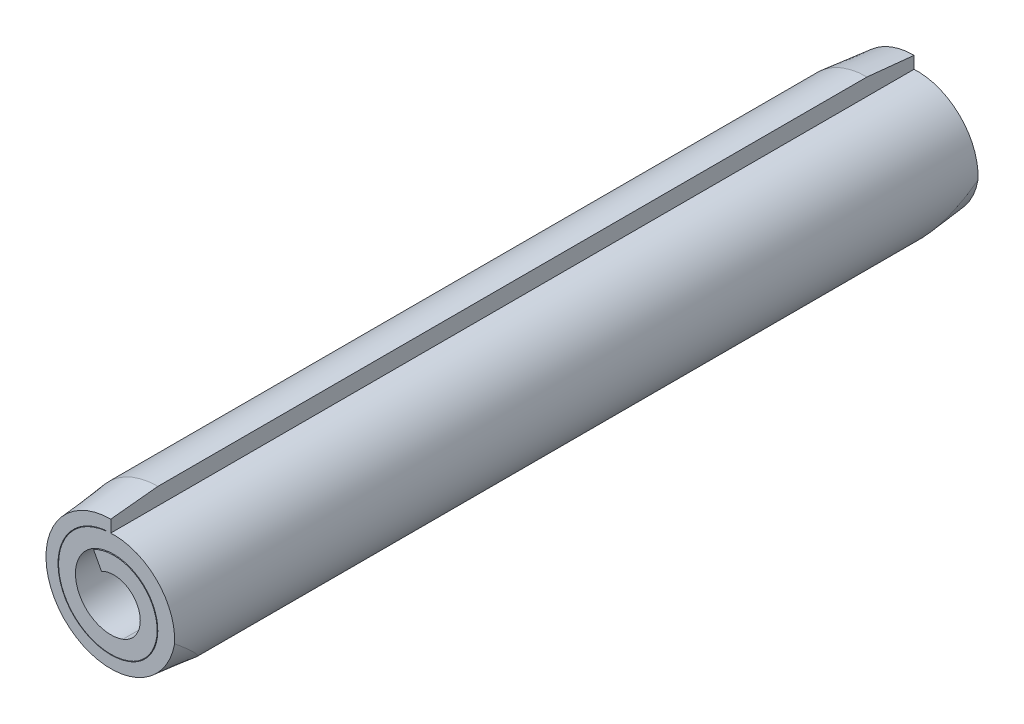
ISO-10303-21;
HEADER;
FILE_DESCRIPTION(('STEP AP214'),'2;1');
FILE_NAME('part.step','',(''),(''),'','','');
FILE_SCHEMA(('AUTOMOTIVE_DESIGN { 1 0 10303 214 1 1 1 1 }'));
ENDSEC;
DATA;
#1=APPLICATION_CONTEXT('core data for automotive mechanical design processes');
#2=APPLICATION_PROTOCOL_DEFINITION('international standard','automotive_design',2000,#1);
#3=PRODUCT_CONTEXT('',#1,'mechanical');
#4=PRODUCT('Part','Part','',(#3));
#5=PRODUCT_RELATED_PRODUCT_CATEGORY('part','',(#4));
#6=PRODUCT_DEFINITION_FORMATION('','',#4);
#7=PRODUCT_DEFINITION_CONTEXT('part definition',#1,'design');
#8=PRODUCT_DEFINITION('design','',#6,#7);
#9=PRODUCT_DEFINITION_SHAPE('','',#8);
#10=(LENGTH_UNIT() NAMED_UNIT(*) SI_UNIT(.MILLI.,.METRE.));
#11=(NAMED_UNIT(*) PLANE_ANGLE_UNIT() SI_UNIT($,.RADIAN.));
#12=(NAMED_UNIT(*) SI_UNIT($,.STERADIAN.) SOLID_ANGLE_UNIT());
#13=UNCERTAINTY_MEASURE_WITH_UNIT(LENGTH_MEASURE(1.E-05),#10,'distance_accuracy_value','');
#14=(GEOMETRIC_REPRESENTATION_CONTEXT(3) GLOBAL_UNCERTAINTY_ASSIGNED_CONTEXT((#13)) GLOBAL_UNIT_ASSIGNED_CONTEXT((#10,
#11,#12)) REPRESENTATION_CONTEXT('',''));
#15=CARTESIAN_POINT('',(0.,0.,0.));
#16=DIRECTION('',(0.,0.,1.));
#17=DIRECTION('',(1.,0.,0.));
#18=AXIS2_PLACEMENT_3D('',#15,#16,#17);
#19=CARTESIAN_POINT('',(0.0723292008975473,-0.198722846233208,-9.525));
#20=DIRECTION('',(0.,0.,1.));
#21=DIRECTION('',(1.,0.,0.));
#22=AXIS2_PLACEMENT_3D('',#19,#20,#21);
#23=CYLINDRICAL_SURFACE('',#22,1.02677356415547);
#24=CARTESIAN_POINT('',(0.0723292008975473,-0.198722846233208,9.525));
#25=DIRECTION('',(0.,0.,1.));
#26=DIRECTION('',(1.,0.,0.));
#27=AXIS2_PLACEMENT_3D('',#24,#25,#26);
#28=CIRCLE('',#27,1.02677356415547);
#29=CARTESIAN_POINT('',(0.423506442473011,-1.16357438768815,9.525));
#30=VERTEX_POINT('',#29);
#31=CARTESIAN_POINT('',(-0.408926515705381,0.708281501763831,9.525));
#32=VERTEX_POINT('',#31);
#33=EDGE_CURVE('E245',#30,#32,#28,.T.);
#34=ORIENTED_EDGE('',*,*,#33,.F.);
#35=DIRECTION('',(0.,0.,1.));
#36=VECTOR('',#35,1.);
#37=CARTESIAN_POINT('',(0.423506442473011,-1.16357438768815,-9.525));
#38=LINE('',#37,#36);
#39=CARTESIAN_POINT('',(0.423506442473011,-1.16357438768815,-9.525));
#40=VERTEX_POINT('',#39);
#41=EDGE_CURVE('E206',#40,#30,#38,.T.);
#42=ORIENTED_EDGE('',*,*,#41,.F.);
#43=CARTESIAN_POINT('',(0.0723292008975473,-0.198722846233208,-9.525));
#44=DIRECTION('',(0.,0.,1.));
#45=DIRECTION('',(1.,0.,0.));
#46=AXIS2_PLACEMENT_3D('',#43,#44,#45);
#47=CIRCLE('',#46,1.02677356415547);
#48=CARTESIAN_POINT('',(-0.408926515705381,0.708281501763831,-9.525));
#49=VERTEX_POINT('',#48);
#50=EDGE_CURVE('E223',#40,#49,#47,.T.);
#51=ORIENTED_EDGE('',*,*,#50,.T.);
#52=DIRECTION('',(0.,0.,1.));
#53=VECTOR('',#52,1.);
#54=CARTESIAN_POINT('',(-0.408926515705381,0.708281501763831,-9.525));
#55=LINE('',#54,#53);
#56=EDGE_CURVE('E202',#49,#32,#55,.T.);
#57=ORIENTED_EDGE('',*,*,#56,.T.);
#58=EDGE_LOOP('',(#34,#42,#51,#57));
#59=FACE_BOUND('',#58,.T.);
#60=ADVANCED_FACE('F41',(#59),#23,.T.);
#61=CARTESIAN_POINT('',(0.,0.,-9.525));
#62=DIRECTION('',(0.,0.,1.));
#63=DIRECTION('',(1.,0.,0.));
#64=AXIS2_PLACEMENT_3D('',#61,#62,#63);
#65=CYLINDRICAL_SURFACE('',#64,1.23825);
#66=CARTESIAN_POINT('',(0.,0.,9.525));
#67=DIRECTION('',(0.,0.,1.));
#68=DIRECTION('',(1.,0.,0.));
#69=AXIS2_PLACEMENT_3D('',#66,#67,#68);
#70=CIRCLE('',#69,1.23825);
#71=CARTESIAN_POINT('',(-0.423506442473011,1.16357438768815,9.525));
#72=VERTEX_POINT('',#71);
#73=EDGE_CURVE('E219',#72,#30,#70,.T.);
#74=ORIENTED_EDGE('',*,*,#73,.F.);
#75=DIRECTION('',(0.,0.,1.));
#76=VECTOR('',#75,1.);
#77=CARTESIAN_POINT('',(-0.423506442473011,1.16357438768815,-9.525));
#78=LINE('',#77,#76);
#79=CARTESIAN_POINT('',(-0.423506442473011,1.16357438768815,-9.525));
#80=VERTEX_POINT('',#79);
#81=EDGE_CURVE('E181',#80,#72,#78,.T.);
#82=ORIENTED_EDGE('',*,*,#81,.F.);
#83=CARTESIAN_POINT('',(0.,0.,-9.525));
#84=DIRECTION('',(0.,0.,1.));
#85=DIRECTION('',(1.,0.,0.));
#86=AXIS2_PLACEMENT_3D('',#83,#84,#85);
#87=CIRCLE('',#86,1.23825);
#88=EDGE_CURVE('E204',#80,#40,#87,.T.);
#89=ORIENTED_EDGE('',*,*,#88,.T.);
#90=ORIENTED_EDGE('',*,*,#41,.T.);
#91=EDGE_LOOP('',(#74,#82,#89,#90));
#92=FACE_BOUND('',#91,.T.);
#93=ADVANCED_FACE('F300',(#92),#65,.T.);
#94=CARTESIAN_POINT('',(0.070584407078835,-0.193929064614692,-9.525));
#95=DIRECTION('',(0.,0.,1.));
#96=DIRECTION('',(1.,0.,0.));
#97=AXIS2_PLACEMENT_3D('',#94,#95,#96);
#98=CYLINDRICAL_SURFACE('',#97,1.444625);
#99=CARTESIAN_POINT('',(1.51338198021924,-0.26656895424264,-9.5252000000002));
#100=CARTESIAN_POINT('',(1.51089961633587,-0.315391876463451,-9.4660655268853));
#101=CARTESIAN_POINT('',(1.5059430194148,-0.364913270987442,-9.40753748279915));
#102=CARTESIAN_POINT('',(1.49040981446653,-0.46531349133775,-9.29197480502568));
#103=CARTESIAN_POINT('',(1.47980838498277,-0.516197362369289,-9.23494794372134));
#104=CARTESIAN_POINT('',(1.45209720014122,-0.61969449280818,-9.12227784588439));
#105=CARTESIAN_POINT('',(1.43488267794412,-0.672322436061996,-9.06667310572743));
#106=CARTESIAN_POINT('',(1.39312479842197,-0.777921487953495,-8.95880272560879));
#107=CARTESIAN_POINT('',(1.36859630613241,-0.830891689364134,-8.90653057153403));
#108=CARTESIAN_POINT('',(1.31234837776601,-0.93439523525719,-8.80843971790201));
#109=CARTESIAN_POINT('',(1.28096277665923,-0.984939906408166,-8.7624448238536));
#110=CARTESIAN_POINT('',(1.20962819522006,-1.08457846568461,-8.67616176181149));
#111=CARTESIAN_POINT('',(1.16971146167616,-1.13367704597314,-8.63585302770475));
#112=CARTESIAN_POINT('',(1.08722869923109,-1.22176234005993,-8.56836295988293));
#113=CARTESIAN_POINT('',(1.0459805130288,-1.26115398319361,-8.5401179828462));
#114=CARTESIAN_POINT('',(0.956656504602063,-1.33638777602722,-8.4907200027136));
#115=CARTESIAN_POINT('',(0.908597345622407,-1.37223823642493,-8.46955010263228));
#116=CARTESIAN_POINT('',(0.812767792344781,-1.43446447237422,-8.43805287113598));
#117=CARTESIAN_POINT('',(0.765758014878878,-1.46146585880572,-8.42667997520842));
#118=CARTESIAN_POINT('',(0.6922828209848,-1.49822785129788,-8.41516460056283));
#119=CARTESIAN_POINT('',(0.667175867343946,-1.50990321379894,-8.41224972095523));
#120=CARTESIAN_POINT('',(0.61618536937932,-1.53185054939576,-8.40835762849501));
#121=CARTESIAN_POINT('',(0.59030119502463,-1.54212134429715,-8.40738203320162));
#122=CARTESIAN_POINT('',(0.56412541472657,-1.55163251691753,-8.40740014481217));
#123=B_SPLINE_CURVE_WITH_KNOTS('',3,(#99,#100,#101,#102,#103,#104,#105,#106,#107,#108,#109,#110,
#111,#112,#113,#114,#115,#116,#117,#118,#119,#120,#121,#122),.UNSPECIFIED.,.F.,.F.,(4,2,2,2,2,2,
2,2,2,2,2,4),(0.,0.230214832455356,0.461450428220674,0.696511388492058,0.931097825983927,
1.15612300491044,1.38031219803197,1.57053223385534,1.76029467679453,1.92560731922091,
2.00903077765844,2.09252379054774),.UNSPECIFIED.);
#124=CARTESIAN_POINT('',(1.51337365800672,-0.266734064662456,-9.525));
#125=VERTEX_POINT('',#124);
#126=CARTESIAN_POINT('',(0.564675256630679,-1.55143251691753,-8.4074));
#127=VERTEX_POINT('',#126);
#128=EDGE_CURVE('E155',#125,#127,#123,.T.);
#129=ORIENTED_EDGE('',*,*,#128,.F.);
#130=CARTESIAN_POINT('',(0.070584407078835,-0.193929064614692,-9.525));
#131=DIRECTION('',(0.,0.,1.));
#132=DIRECTION('',(1.,0.,0.));
#133=AXIS2_PLACEMENT_3D('',#130,#131,#132);
#134=CIRCLE('',#133,1.444625);
#135=EDGE_CURVE('E251',#125,#80,#134,.T.);
#136=ORIENTED_EDGE('',*,*,#135,.T.);
#137=ORIENTED_EDGE('',*,*,#81,.T.);
#138=CARTESIAN_POINT('',(0.070584407078835,-0.193929064614692,9.525));
#139=DIRECTION('',(0.,0.,1.));
#140=DIRECTION('',(1.,0.,0.));
#141=AXIS2_PLACEMENT_3D('',#138,#139,#140);
#142=CIRCLE('',#141,1.444625);
#143=CARTESIAN_POINT('',(1.51337365800672,-0.266734064662477,9.525));
#144=VERTEX_POINT('',#143);
#145=EDGE_CURVE('E224',#144,#72,#142,.T.);
#146=ORIENTED_EDGE('',*,*,#145,.F.);
#147=CARTESIAN_POINT('',(0.56412541472657,-1.55163251691753,8.4074001448122));
#148=CARTESIAN_POINT('',(0.592646351616551,-1.54127402859743,8.40737506341495));
#149=CARTESIAN_POINT('',(0.620828354621361,-1.53000343116919,8.40853822031942));
#150=CARTESIAN_POINT('',(0.676244811057592,-1.50580687047318,8.41316356481416));
#151=CARTESIAN_POINT('',(0.703480208606886,-1.49288262049096,8.4166233882394));
#152=CARTESIAN_POINT('',(0.756521834832578,-1.46566501465061,8.42571831622505));
#153=CARTESIAN_POINT('',(0.782339796234202,-1.45138694733874,8.43133090180808));
#154=CARTESIAN_POINT('',(0.832667029478267,-1.42154000966076,8.44459758832117));
#155=CARTESIAN_POINT('',(0.857176045818303,-1.40597088878764,8.45225208609136));
#156=CARTESIAN_POINT('',(0.928354404868567,-1.35773321634395,8.47798459045798));
#157=CARTESIAN_POINT('',(0.972920414652517,-1.32340633828342,8.49887596790641));
#158=CARTESIAN_POINT('',(1.05595356830067,-1.2517640285874,8.54679078921747));
#159=CARTESIAN_POINT('',(1.09440765271169,-1.21444244735299,8.57382707145587));
#160=CARTESIAN_POINT('',(1.18255023181191,-1.11938888697862,8.64704071354569));
#161=CARTESIAN_POINT('',(1.22861753659074,-1.06055169918424,8.6961352088261));
#162=CARTESIAN_POINT('',(1.30904174833182,-0.941183543526781,8.80184728813598));
#163=CARTESIAN_POINT('',(1.34332826098341,-0.880644655043237,8.85850737900593));
#164=CARTESIAN_POINT('',(1.39532957213194,-0.772529114694265,8.96428472741708));
#165=CARTESIAN_POINT('',(1.4150178834676,-0.724933450569182,9.01244400835425));
#166=CARTESIAN_POINT('',(1.44868814909151,-0.630166459293997,9.11121404617762));
#167=CARTESIAN_POINT('',(1.46266330194571,-0.582995702915864,9.1618276452116));
#168=CARTESIAN_POINT('',(1.48526384856603,-0.490335934945068,9.26389706823958));
#169=CARTESIAN_POINT('',(1.49398597954133,-0.444832002027162,9.31531853988123));
#170=CARTESIAN_POINT('',(1.50692636095077,-0.354890931178015,9.41939593947729));
#171=CARTESIAN_POINT('',(1.51115704503026,-0.310451182834739,9.47204804497057));
#172=CARTESIAN_POINT('',(1.51338198021924,-0.266568954242662,9.5252000000002));
#173=B_SPLINE_CURVE_WITH_KNOTS('',3,(#147,#148,#149,#150,#151,#152,#153,#154,#155,#156,#157,
#158,#159,#160,#161,#162,#163,#164,#165,#166,#167,#168,#169,#170,#171,#172),.UNSPECIFIED.,.F.,
.F.,(4,2,2,2,2,2,2,2,2,2,2,2,4),(0.,0.0909808846405536,0.181868259421924,0.271829750538772,
0.361808738182344,0.540937746238962,0.720444500921447,0.987180636276189,1.25548397012386,
1.46673601132264,1.67823881780149,1.88571706529687,2.09261944224902),.UNSPECIFIED.);
#174=CARTESIAN_POINT('',(0.56467525663068,-1.55143251691754,8.4074));
#175=VERTEX_POINT('',#174);
#176=EDGE_CURVE('E69',#175,#144,#173,.T.);
#177=ORIENTED_EDGE('',*,*,#176,.F.);
#178=DIRECTION('',(0.,0.,1.));
#179=VECTOR('',#178,1.);
#180=CARTESIAN_POINT('',(0.56467525663068,-1.55143251691753,-9.525));
#181=LINE('',#180,#179);
#182=EDGE_CURVE('E175',#127,#175,#181,.T.);
#183=ORIENTED_EDGE('',*,*,#182,.F.);
#184=EDGE_LOOP('',(#129,#136,#137,#146,#177,#183));
#185=FACE_BOUND('',#184,.T.);
#186=ADVANCED_FACE('F282',(#185),#98,.T.);
#187=CARTESIAN_POINT('',(0.,0.,-9.525));
#188=DIRECTION('',(0.,0.,1.));
#189=DIRECTION('',(1.,0.,0.));
#190=AXIS2_PLACEMENT_3D('',#187,#188,#189);
#191=CYLINDRICAL_SURFACE('',#190,1.651);
#192=CARTESIAN_POINT('',(0.,0.,-8.4074));
#193=DIRECTION('',(0.,0.,-1.));
#194=DIRECTION('',(0.,1.,0.));
#195=AXIS2_PLACEMENT_3D('',#192,#193,#194);
#196=CIRCLE('',#195,1.651);
#197=CARTESIAN_POINT('',(0.,1.651,-8.4074));
#198=VERTEX_POINT('',#197);
#199=EDGE_CURVE('E152',#127,#198,#196,.T.);
#200=ORIENTED_EDGE('',*,*,#199,.F.);
#201=ORIENTED_EDGE('',*,*,#182,.T.);
#202=CARTESIAN_POINT('',(0.,0.,8.4074));
#203=DIRECTION('',(0.,0.,-1.));
#204=DIRECTION('',(0.,1.,0.));
#205=AXIS2_PLACEMENT_3D('',#202,#203,#204);
#206=CIRCLE('',#205,1.651);
#207=CARTESIAN_POINT('',(0.,1.651,8.4074));
#208=VERTEX_POINT('',#207);
#209=EDGE_CURVE('E173',#175,#208,#206,.T.);
#210=ORIENTED_EDGE('',*,*,#209,.T.);
#211=DIRECTION('',(0.,0.,1.));
#212=VECTOR('',#211,1.);
#213=CARTESIAN_POINT('',(0.,1.651,-9.525));
#214=LINE('',#213,#212);
#215=EDGE_CURVE('E165',#198,#208,#214,.T.);
#216=ORIENTED_EDGE('',*,*,#215,.F.);
#217=EDGE_LOOP('',(#200,#201,#210,#216));
#218=FACE_BOUND('',#217,.T.);
#219=ADVANCED_FACE('F172',(#218),#191,.T.);
#220=CARTESIAN_POINT('',(0.,1.651,-9.525));
#221=DIRECTION('',(-1.,0.,0.));
#222=DIRECTION('',(0.,-1.,0.));
#223=AXIS2_PLACEMENT_3D('',#220,#221,#222);
#224=PLANE('',#223);
#225=DIRECTION('',(0.,-1.,0.));
#226=VECTOR('',#225,1.);
#227=CARTESIAN_POINT('',(0.,1.651,-9.525));
#228=LINE('',#227,#226);
#229=CARTESIAN_POINT('',(0.,1.5367,-9.525));
#230=VERTEX_POINT('',#229);
#231=CARTESIAN_POINT('',(0.,1.2506325,-9.525));
#232=VERTEX_POINT('',#231);
#233=EDGE_CURVE('E168',#230,#232,#228,.T.);
#234=ORIENTED_EDGE('',*,*,#233,.F.);
#235=DIRECTION('',(0.,-0.101742015409961,-0.99481081734183));
#236=VECTOR('',#235,1.);
#237=CARTESIAN_POINT('',(0.,0.,-24.5505111111109));
#238=LINE('',#237,#236);
#239=EDGE_CURVE('E59',#230,#198,#238,.F.);
#240=ORIENTED_EDGE('',*,*,#239,.T.);
#241=ORIENTED_EDGE('',*,*,#215,.T.);
#242=DIRECTION('',(0.,0.101742015409961,-0.99481081734183));
#243=VECTOR('',#242,1.);
#244=CARTESIAN_POINT('',(0.,0.,24.550511111111));
#245=LINE('',#244,#243);
#246=CARTESIAN_POINT('',(0.,1.5367,9.525));
#247=VERTEX_POINT('',#246);
#248=EDGE_CURVE('E280',#208,#247,#245,.F.);
#249=ORIENTED_EDGE('',*,*,#248,.T.);
#250=DIRECTION('',(0.,-1.,0.));
#251=VECTOR('',#250,1.);
#252=CARTESIAN_POINT('',(0.,1.651,9.525));
#253=LINE('',#252,#251);
#254=CARTESIAN_POINT('',(0.,1.2506325,9.525));
#255=VERTEX_POINT('',#254);
#256=EDGE_CURVE('E227',#247,#255,#253,.T.);
#257=ORIENTED_EDGE('',*,*,#256,.T.);
#258=DIRECTION('',(0.,0.,1.));
#259=VECTOR('',#258,1.);
#260=CARTESIAN_POINT('',(0.,1.2506325,-9.525));
#261=LINE('',#260,#259);
#262=EDGE_CURVE('E176',#232,#255,#261,.T.);
#263=ORIENTED_EDGE('',*,*,#262,.F.);
#264=EDGE_LOOP('',(#234,#240,#241,#249,#257,#263));
#265=FACE_BOUND('',#264,.T.);
#266=ADVANCED_FACE('F163',(#265),#224,.F.);
#267=CARTESIAN_POINT('',(0.,0.,-9.525));
#268=DIRECTION('',(0.,0.,1.));
#269=DIRECTION('',(1.,0.,0.));
#270=AXIS2_PLACEMENT_3D('',#267,#268,#269);
#271=CYLINDRICAL_SURFACE('',#270,1.2506325);
#272=CARTESIAN_POINT('',(0.,0.,9.525));
#273=DIRECTION('',(0.,0.,1.));
#274=DIRECTION('',(1.,0.,0.));
#275=AXIS2_PLACEMENT_3D('',#272,#273,#274);
#276=CIRCLE('',#275,1.2506325);
#277=CARTESIAN_POINT('',(0.42774150689774,-1.17521013156503,9.525));
#278=VERTEX_POINT('',#277);
#279=EDGE_CURVE('E230',#255,#278,#276,.T.);
#280=ORIENTED_EDGE('',*,*,#279,.T.);
#281=DIRECTION('',(0.,0.,1.));
#282=VECTOR('',#281,1.);
#283=CARTESIAN_POINT('',(0.42774150689774,-1.17521013156503,-9.525));
#284=LINE('',#283,#282);
#285=CARTESIAN_POINT('',(0.42774150689774,-1.17521013156503,-9.525));
#286=VERTEX_POINT('',#285);
#287=EDGE_CURVE('E185',#286,#278,#284,.T.);
#288=ORIENTED_EDGE('',*,*,#287,.F.);
#289=CARTESIAN_POINT('',(0.,0.,-9.525));
#290=DIRECTION('',(0.,0.,1.));
#291=DIRECTION('',(1.,0.,0.));
#292=AXIS2_PLACEMENT_3D('',#289,#290,#291);
#293=CIRCLE('',#292,1.2506325);
#294=EDGE_CURVE('E256',#232,#286,#293,.T.);
#295=ORIENTED_EDGE('',*,*,#294,.F.);
#296=ORIENTED_EDGE('',*,*,#262,.T.);
#297=EDGE_LOOP('',(#280,#288,#295,#296));
#298=FACE_BOUND('',#297,.T.);
#299=ADVANCED_FACE('F336',(#298),#271,.F.);
#300=CARTESIAN_POINT('',(0.070584407078835,-0.193929064614692,-9.525));
#301=DIRECTION('',(0.,0.,1.));
#302=DIRECTION('',(1.,0.,0.));
#303=AXIS2_PLACEMENT_3D('',#300,#301,#302);
#304=CYLINDRICAL_SURFACE('',#303,1.0442575);
#305=CARTESIAN_POINT('',(0.070584407078835,-0.193929064614692,9.525));
#306=DIRECTION('',(0.,0.,1.));
#307=DIRECTION('',(1.,0.,0.));
#308=AXIS2_PLACEMENT_3D('',#305,#306,#307);
#309=CIRCLE('',#308,1.0442575);
#310=CARTESIAN_POINT('',(-0.286572692740071,0.787352002335648,9.525));
#311=VERTEX_POINT('',#310);
#312=EDGE_CURVE('E232',#278,#311,#309,.T.);
#313=ORIENTED_EDGE('',*,*,#312,.T.);
#314=DIRECTION('',(0.,0.,1.));
#315=VECTOR('',#314,1.);
#316=CARTESIAN_POINT('',(-0.286572692740071,0.787352002335648,-9.525));
#317=LINE('',#316,#315);
#318=CARTESIAN_POINT('',(-0.286572692740071,0.787352002335648,-9.525));
#319=VERTEX_POINT('',#318);
#320=EDGE_CURVE('E192',#319,#311,#317,.T.);
#321=ORIENTED_EDGE('',*,*,#320,.F.);
#322=CARTESIAN_POINT('',(0.070584407078835,-0.193929064614692,-9.525));
#323=DIRECTION('',(0.,0.,1.));
#324=DIRECTION('',(1.,0.,0.));
#325=AXIS2_PLACEMENT_3D('',#322,#323,#324);
#326=CIRCLE('',#325,1.0442575);
#327=EDGE_CURVE('E259',#286,#319,#326,.T.);
#328=ORIENTED_EDGE('',*,*,#327,.F.);
#329=ORIENTED_EDGE('',*,*,#287,.T.);
#330=EDGE_LOOP('',(#313,#321,#328,#329));
#331=FACE_BOUND('',#330,.T.);
#332=ADVANCED_FACE('F332',(#331),#304,.F.);
#333=CARTESIAN_POINT('',(0.,0.,-9.525));
#334=DIRECTION('',(0.,0.,1.));
#335=DIRECTION('',(1.,0.,0.));
#336=AXIS2_PLACEMENT_3D('',#333,#334,#335);
#337=CYLINDRICAL_SURFACE('',#336,0.8378825);
#338=CARTESIAN_POINT('',(0.,0.,9.525));
#339=DIRECTION('',(0.,0.,1.));
#340=DIRECTION('',(1.,0.,0.));
#341=AXIS2_PLACEMENT_3D('',#338,#339,#340);
#342=CIRCLE('',#341,0.8378825);
#343=CARTESIAN_POINT('',(0.286572692740071,-0.787352002335649,9.525));
#344=VERTEX_POINT('',#343);
#345=EDGE_CURVE('E235',#311,#344,#342,.T.);
#346=ORIENTED_EDGE('',*,*,#345,.T.);
#347=DIRECTION('',(0.,0.,1.));
#348=VECTOR('',#347,1.);
#349=CARTESIAN_POINT('',(0.286572692740071,-0.787352002335649,-9.525));
#350=LINE('',#349,#348);
#351=CARTESIAN_POINT('',(0.286572692740071,-0.787352002335649,-9.525));
#352=VERTEX_POINT('',#351);
#353=EDGE_CURVE('E195',#352,#344,#350,.T.);
#354=ORIENTED_EDGE('',*,*,#353,.F.);
#355=CARTESIAN_POINT('',(0.,0.,-9.525));
#356=DIRECTION('',(0.,0.,1.));
#357=DIRECTION('',(1.,0.,0.));
#358=AXIS2_PLACEMENT_3D('',#355,#356,#357);
#359=CIRCLE('',#358,0.8378825);
#360=EDGE_CURVE('E261',#319,#352,#359,.T.);
#361=ORIENTED_EDGE('',*,*,#360,.F.);
#362=ORIENTED_EDGE('',*,*,#320,.T.);
#363=EDGE_LOOP('',(#346,#354,#361,#362));
#364=FACE_BOUND('',#363,.T.);
#365=ADVANCED_FACE('F328',(#364),#337,.F.);
#366=CARTESIAN_POINT('',(0.0723292008975473,-0.198722846233208,-9.525));
#367=DIRECTION('',(0.,0.,1.));
#368=DIRECTION('',(1.,0.,0.));
#369=AXIS2_PLACEMENT_3D('',#366,#367,#368);
#370=CYLINDRICAL_SURFACE('',#369,0.626406064155472);
#371=CARTESIAN_POINT('',(0.0723292008975473,-0.198722846233208,9.525));
#372=DIRECTION('',(0.,0.,1.));
#373=DIRECTION('',(1.,0.,0.));
#374=AXIS2_PLACEMENT_3D('',#371,#372,#373);
#375=CIRCLE('',#374,0.626406064155472);
#376=CARTESIAN_POINT('',(-0.221271559594875,0.354615342082962,9.525));
#377=VERTEX_POINT('',#376);
#378=EDGE_CURVE('E238',#344,#377,#375,.T.);
#379=ORIENTED_EDGE('',*,*,#378,.T.);
#380=DIRECTION('',(0.,0.,1.));
#381=VECTOR('',#380,1.);
#382=CARTESIAN_POINT('',(-0.221271559594875,0.354615342082962,-9.525));
#383=LINE('',#382,#381);
#384=CARTESIAN_POINT('',(-0.221271559594875,0.354615342082962,-9.525));
#385=VERTEX_POINT('',#384);
#386=EDGE_CURVE('E198',#385,#377,#383,.T.);
#387=ORIENTED_EDGE('',*,*,#386,.F.);
#388=CARTESIAN_POINT('',(0.0723292008975473,-0.198722846233208,-9.525));
#389=DIRECTION('',(0.,0.,1.));
#390=DIRECTION('',(1.,0.,0.));
#391=AXIS2_PLACEMENT_3D('',#388,#389,#390);
#392=CIRCLE('',#391,0.626406064155472);
#393=EDGE_CURVE('E264',#352,#385,#392,.T.);
#394=ORIENTED_EDGE('',*,*,#393,.F.);
#395=ORIENTED_EDGE('',*,*,#353,.T.);
#396=EDGE_LOOP('',(#379,#387,#394,#395));
#397=FACE_BOUND('',#396,.T.);
#398=ADVANCED_FACE('F323',(#397),#370,.F.);
#399=CARTESIAN_POINT('',(-0.221271559594875,0.354615342082962,-9.525));
#400=DIRECTION('',(0.883353817881994,0.468706765935062,0.));
#401=DIRECTION('',(-0.468706765935062,0.883353817881994,0.));
#402=AXIS2_PLACEMENT_3D('',#399,#400,#401);
#403=PLANE('',#402);
#404=DIRECTION('',(-0.468706765935062,0.883353817881994,0.));
#405=VECTOR('',#404,1.);
#406=CARTESIAN_POINT('',(-0.221271559594875,0.354615342082962,9.525));
#407=LINE('',#406,#405);
#408=EDGE_CURVE('E241',#377,#32,#407,.T.);
#409=ORIENTED_EDGE('',*,*,#408,.T.);
#410=ORIENTED_EDGE('',*,*,#56,.F.);
#411=DIRECTION('',(-0.468706765935062,0.883353817881994,0.));
#412=VECTOR('',#411,1.);
#413=CARTESIAN_POINT('',(-0.221271559594875,0.354615342082962,-9.525));
#414=LINE('',#413,#412);
#415=EDGE_CURVE('E267',#385,#49,#414,.T.);
#416=ORIENTED_EDGE('',*,*,#415,.F.);
#417=ORIENTED_EDGE('',*,*,#386,.T.);
#418=EDGE_LOOP('',(#409,#410,#416,#417));
#419=FACE_BOUND('',#418,.T.);
#420=ADVANCED_FACE('F296',(#419),#403,.F.);
#421=CARTESIAN_POINT('',(0.0723292008975473,-0.198722846233208,-9.525));
#422=DIRECTION('',(0.,0.,1.));
#423=DIRECTION('',(1.,0.,0.));
#424=AXIS2_PLACEMENT_3D('',#421,#422,#423);
#425=PLANE('',#424);
#426=ORIENTED_EDGE('',*,*,#135,.F.);
#427=CARTESIAN_POINT('',(0.,0.,-9.525));
#428=DIRECTION('',(0.,0.,1.));
#429=DIRECTION('',(1.,0.,0.));
#430=AXIS2_PLACEMENT_3D('',#427,#428,#429);
#431=CIRCLE('',#430,1.5367);
#432=EDGE_CURVE('E11',#125,#230,#431,.F.);
#433=ORIENTED_EDGE('',*,*,#432,.T.);
#434=ORIENTED_EDGE('',*,*,#233,.T.);
#435=ORIENTED_EDGE('',*,*,#294,.T.);
#436=ORIENTED_EDGE('',*,*,#327,.T.);
#437=ORIENTED_EDGE('',*,*,#360,.T.);
#438=ORIENTED_EDGE('',*,*,#393,.T.);
#439=ORIENTED_EDGE('',*,*,#415,.T.);
#440=ORIENTED_EDGE('',*,*,#50,.F.);
#441=ORIENTED_EDGE('',*,*,#88,.F.);
#442=EDGE_LOOP('',(#426,#433,#434,#435,#436,#437,#438,#439,#440,#441));
#443=FACE_BOUND('',#442,.T.);
#444=ADVANCED_FACE('F293',(#443),#425,.F.);
#445=CARTESIAN_POINT('',(0.0723292008975473,-0.198722846233208,9.525));
#446=DIRECTION('',(0.,0.,1.));
#447=DIRECTION('',(1.,0.,0.));
#448=AXIS2_PLACEMENT_3D('',#445,#446,#447);
#449=PLANE('',#448);
#450=CARTESIAN_POINT('',(0.,0.,9.525));
#451=DIRECTION('',(0.,0.,1.));
#452=DIRECTION('',(1.,0.,0.));
#453=AXIS2_PLACEMENT_3D('',#450,#451,#452);
#454=CIRCLE('',#453,1.5367);
#455=EDGE_CURVE('E49',#144,#247,#454,.F.);
#456=ORIENTED_EDGE('',*,*,#455,.F.);
#457=ORIENTED_EDGE('',*,*,#145,.T.);
#458=ORIENTED_EDGE('',*,*,#73,.T.);
#459=ORIENTED_EDGE('',*,*,#33,.T.);
#460=ORIENTED_EDGE('',*,*,#408,.F.);
#461=ORIENTED_EDGE('',*,*,#378,.F.);
#462=ORIENTED_EDGE('',*,*,#345,.F.);
#463=ORIENTED_EDGE('',*,*,#312,.F.);
#464=ORIENTED_EDGE('',*,*,#279,.F.);
#465=ORIENTED_EDGE('',*,*,#256,.F.);
#466=EDGE_LOOP('',(#456,#457,#458,#459,#460,#461,#462,#463,#464,#465));
#467=FACE_BOUND('',#466,.T.);
#468=ADVANCED_FACE('F291',(#467),#449,.T.);
#469=CARTESIAN_POINT('',(0.,0.,9.525));
#470=DIRECTION('',(0.,0.,-1.));
#471=DIRECTION('',(0.,1.,0.));
#472=AXIS2_PLACEMENT_3D('',#469,#470,#471);
#473=CONICAL_SURFACE('',#472,1.5367,0.101918367480875);
#474=ORIENTED_EDGE('',*,*,#176,.T.);
#475=ORIENTED_EDGE('',*,*,#455,.T.);
#476=ORIENTED_EDGE('',*,*,#248,.F.);
#477=ORIENTED_EDGE('',*,*,#209,.F.);
#478=EDGE_LOOP('',(#474,#475,#476,#477));
#479=FACE_BOUND('',#478,.T.);
#480=ADVANCED_FACE('F286',(#479),#473,.T.);
#481=CARTESIAN_POINT('',(0.,0.,-8.4074));
#482=DIRECTION('',(0.,0.,1.));
#483=DIRECTION('',(0.,-1.,0.));
#484=AXIS2_PLACEMENT_3D('',#481,#482,#483);
#485=CONICAL_SURFACE('',#484,1.651,0.101918367480875);
#486=ORIENTED_EDGE('',*,*,#128,.T.);
#487=ORIENTED_EDGE('',*,*,#199,.T.);
#488=ORIENTED_EDGE('',*,*,#239,.F.);
#489=ORIENTED_EDGE('',*,*,#432,.F.);
#490=EDGE_LOOP('',(#486,#487,#488,#489));
#491=FACE_BOUND('',#490,.T.);
#492=ADVANCED_FACE('F153',(#491),#485,.T.);
#493=CLOSED_SHELL('',(#60,#93,#186,#219,#266,#299,#332,#365,#398,#420,#444,#468,#480,#492));
#494=MANIFOLD_SOLID_BREP('B2',#493);
#495=ADVANCED_BREP_SHAPE_REPRESENTATION('',(#18,#494),#14);
#496=SHAPE_DEFINITION_REPRESENTATION(#9,#495);
ENDSEC;
END-ISO-10303-21;
